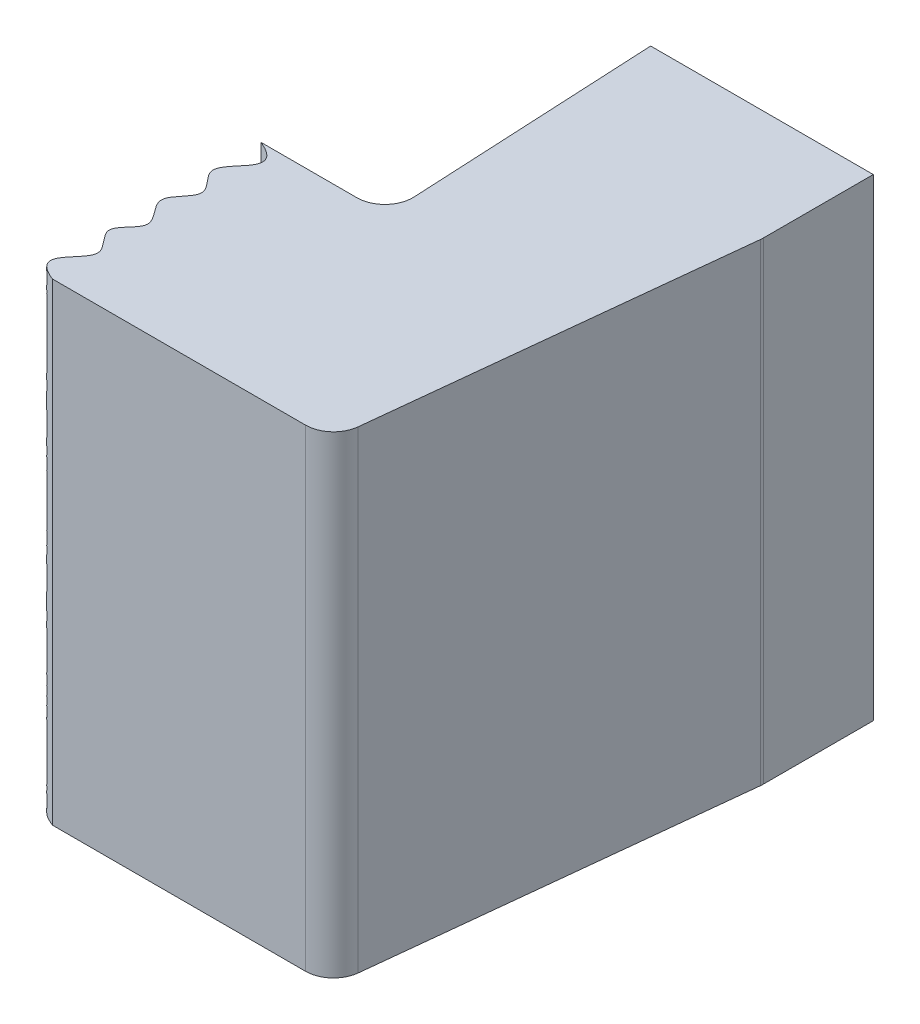
ISO-10303-21;
HEADER;
FILE_DESCRIPTION(('STEP AP214'),'2;1');
FILE_NAME('part.step','',(''),(''),'','','');
FILE_SCHEMA(('AUTOMOTIVE_DESIGN { 1 0 10303 214 1 1 1 1 }'));
ENDSEC;
DATA;
#1=APPLICATION_CONTEXT('core data for automotive mechanical design processes');
#2=APPLICATION_PROTOCOL_DEFINITION('international standard','automotive_design',2000,#1);
#3=PRODUCT_CONTEXT('',#1,'mechanical');
#4=PRODUCT('Part','Part','',(#3));
#5=PRODUCT_RELATED_PRODUCT_CATEGORY('part','',(#4));
#6=PRODUCT_DEFINITION_FORMATION('','',#4);
#7=PRODUCT_DEFINITION_CONTEXT('part definition',#1,'design');
#8=PRODUCT_DEFINITION('design','',#6,#7);
#9=PRODUCT_DEFINITION_SHAPE('','',#8);
#10=(LENGTH_UNIT() NAMED_UNIT(*) SI_UNIT(.MILLI.,.METRE.));
#11=(NAMED_UNIT(*) PLANE_ANGLE_UNIT() SI_UNIT($,.RADIAN.));
#12=(NAMED_UNIT(*) SI_UNIT($,.STERADIAN.) SOLID_ANGLE_UNIT());
#13=UNCERTAINTY_MEASURE_WITH_UNIT(LENGTH_MEASURE(1.E-05),#10,'distance_accuracy_value','');
#14=(GEOMETRIC_REPRESENTATION_CONTEXT(3) GLOBAL_UNCERTAINTY_ASSIGNED_CONTEXT((#13)) GLOBAL_UNIT_ASSIGNED_CONTEXT((#10,
#11,#12)) REPRESENTATION_CONTEXT('',''));
#15=CARTESIAN_POINT('',(0.,0.,0.));
#16=DIRECTION('',(0.,0.,1.));
#17=DIRECTION('',(1.,0.,0.));
#18=AXIS2_PLACEMENT_3D('',#15,#16,#17);
#19=CARTESIAN_POINT('',(0.500000000000004,17.,10.));
#20=DIRECTION('',(0.998752338877845,0.,-0.0499376169438927));
#21=DIRECTION('',(-0.0499376169438927,0.,-0.998752338877845));
#22=AXIS2_PLACEMENT_3D('',#19,#20,#21);
#23=PLANE('',#22);
#24=DIRECTION('',(0.0499376169438927,0.,0.998752338877845));
#25=VECTOR('',#24,1.);
#26=CARTESIAN_POINT('',(0.500000000000004,0.,10.));
#27=LINE('',#26,#25);
#28=CARTESIAN_POINT('',(0.,0.,0.));
#29=VERTEX_POINT('',#28);
#30=CARTESIAN_POINT('',(0.447503119152809,0.,8.95006238305611));
#31=VERTEX_POINT('',#30);
#32=EDGE_CURVE('E187',#29,#31,#27,.T.);
#33=ORIENTED_EDGE('',*,*,#32,.T.);
#34=DIRECTION('',(0.,-1.,0.));
#35=VECTOR('',#34,1.);
#36=CARTESIAN_POINT('',(0.447503119152809,17.,8.95006238305611));
#37=LINE('',#36,#35);
#38=CARTESIAN_POINT('',(0.447503119152809,17.,8.95006238305611));
#39=VERTEX_POINT('',#38);
#40=EDGE_CURVE('E173',#31,#39,#37,.F.);
#41=ORIENTED_EDGE('',*,*,#40,.T.);
#42=DIRECTION('',(0.0499376169438927,0.,0.998752338877845));
#43=VECTOR('',#42,1.);
#44=CARTESIAN_POINT('',(0.500000000000004,17.,10.));
#45=LINE('',#44,#43);
#46=CARTESIAN_POINT('',(0.,17.,0.));
#47=VERTEX_POINT('',#46);
#48=EDGE_CURVE('E124',#47,#39,#45,.T.);
#49=ORIENTED_EDGE('',*,*,#48,.F.);
#50=DIRECTION('',(0.,-1.,0.));
#51=VECTOR('',#50,1.);
#52=CARTESIAN_POINT('',(0.,17.,0.));
#53=LINE('',#52,#51);
#54=EDGE_CURVE('E191',#47,#29,#53,.T.);
#55=ORIENTED_EDGE('',*,*,#54,.T.);
#56=EDGE_LOOP('',(#33,#41,#49,#55));
#57=FACE_BOUND('',#56,.T.);
#58=ADVANCED_FACE('F39',(#57),#23,.F.);
#59=CARTESIAN_POINT('',(-3.5,17.,10.));
#60=DIRECTION('',(0.,0.,1.));
#61=DIRECTION('',(1.,0.,0.));
#62=AXIS2_PLACEMENT_3D('',#59,#60,#61);
#63=PLANE('',#62);
#64=DIRECTION('',(-1.,0.,0.));
#65=VECTOR('',#64,1.);
#66=CARTESIAN_POINT('',(-3.5,17.,10.));
#67=LINE('',#66,#65);
#68=CARTESIAN_POINT('',(-0.551249219725036,17.,10.));
#69=VERTEX_POINT('',#68);
#70=CARTESIAN_POINT('',(-4.,17.,10.));
#71=VERTEX_POINT('',#70);
#72=EDGE_CURVE('E114',#69,#71,#67,.T.);
#73=ORIENTED_EDGE('',*,*,#72,.F.);
#74=DIRECTION('',(0.,-1.,0.));
#75=VECTOR('',#74,1.);
#76=CARTESIAN_POINT('',(-0.551249219725036,0.,10.));
#77=LINE('',#76,#75);
#78=CARTESIAN_POINT('',(-0.551249219725036,0.,10.));
#79=VERTEX_POINT('',#78);
#80=EDGE_CURVE('E174',#69,#79,#77,.T.);
#81=ORIENTED_EDGE('',*,*,#80,.T.);
#82=DIRECTION('',(-1.,0.,0.));
#83=VECTOR('',#82,1.);
#84=CARTESIAN_POINT('',(-3.5,0.,10.));
#85=LINE('',#84,#83);
#86=CARTESIAN_POINT('',(-4.,0.,10.));
#87=VERTEX_POINT('',#86);
#88=EDGE_CURVE('E130',#79,#87,#85,.T.);
#89=ORIENTED_EDGE('',*,*,#88,.T.);
#90=DIRECTION('',(0.,-1.,0.));
#91=VECTOR('',#90,1.);
#92=CARTESIAN_POINT('',(-4.,17.,10.));
#93=LINE('',#92,#91);
#94=EDGE_CURVE('E127',#71,#87,#93,.T.);
#95=ORIENTED_EDGE('',*,*,#94,.F.);
#96=EDGE_LOOP('',(#73,#81,#89,#95));
#97=FACE_BOUND('',#96,.T.);
#98=ADVANCED_FACE('F128',(#97),#63,.F.);
#99=CARTESIAN_POINT('',(-4.,17.,10.));
#100=CARTESIAN_POINT('',(-2.52012960724628,17.,10.6064710764392));
#101=CARTESIAN_POINT('',(-4.86639153091159,17.,11.4740497128714));
#102=CARTESIAN_POINT('',(-3.03225730392594,17.,12.6462103244048));
#103=CARTESIAN_POINT('',(-4.5277805871802,17.,13.5842305746882));
#104=CARTESIAN_POINT('',(-2.99169041630414,17.,14.5770558654744));
#105=CARTESIAN_POINT('',(-4.46066173194962,17.,15.4465882850454));
#106=CARTESIAN_POINT('',(-2.63893410316966,17.,16.6074039343731));
#107=CARTESIAN_POINT('',(-4.90806496712102,17.,17.4384014712583));
#108=CARTESIAN_POINT('',(-3.5,17.,18.));
#109=B_SPLINE_CURVE_WITH_KNOTS('',3,(#99,#100,#101,#102,#103,#104,#105,#106,#107,#108),
.UNSPECIFIED.,.F.,.F.,(4,1,1,1,1,1,1,4),(0.,0.221861930951979,0.329573951751871,
0.444854002419631,0.572311822933468,0.676833042498847,0.78776867286648,1.),.UNSPECIFIED.);
#110=DIRECTION('',(0.,-1.,0.));
#111=VECTOR('',#110,1.);
#112=SURFACE_OF_LINEAR_EXTRUSION('',#109,#111);
#113=CARTESIAN_POINT('',(-4.,0.,10.));
#114=CARTESIAN_POINT('',(-2.52012960724628,0.,10.6064710764392));
#115=CARTESIAN_POINT('',(-4.86639153091159,0.,11.4740497128714));
#116=CARTESIAN_POINT('',(-3.03225730392594,0.,12.6462103244048));
#117=CARTESIAN_POINT('',(-4.5277805871802,0.,13.5842305746882));
#118=CARTESIAN_POINT('',(-2.99169041630414,0.,14.5770558654744));
#119=CARTESIAN_POINT('',(-4.46066173194962,0.,15.4465882850454));
#120=CARTESIAN_POINT('',(-2.63893410316966,0.,16.6074039343731));
#121=CARTESIAN_POINT('',(-4.90806496712102,0.,17.4384014712583));
#122=CARTESIAN_POINT('',(-3.5,0.,18.));
#123=B_SPLINE_CURVE_WITH_KNOTS('',3,(#113,#114,#115,#116,#117,#118,#119,#120,#121,#122),
.UNSPECIFIED.,.F.,.F.,(4,1,1,1,1,1,1,4),(0.,0.221861930951979,0.329573951751871,
0.444854002419631,0.572311822933468,0.676833042498847,0.78776867286648,1.),.UNSPECIFIED.);
#124=CARTESIAN_POINT('',(-3.5,0.,18.));
#125=VERTEX_POINT('',#124);
#126=EDGE_CURVE('E193',#87,#125,#123,.T.);
#127=ORIENTED_EDGE('',*,*,#126,.T.);
#128=DIRECTION('',(0.,-1.,0.));
#129=VECTOR('',#128,1.);
#130=CARTESIAN_POINT('',(-3.5,17.,18.));
#131=LINE('',#130,#129);
#132=CARTESIAN_POINT('',(-3.5,17.,18.));
#133=VERTEX_POINT('',#132);
#134=EDGE_CURVE('E134',#133,#125,#131,.T.);
#135=ORIENTED_EDGE('',*,*,#134,.F.);
#136=EDGE_CURVE('E119',#71,#133,#109,.T.);
#137=ORIENTED_EDGE('',*,*,#136,.F.);
#138=ORIENTED_EDGE('',*,*,#94,.T.);
#139=EDGE_LOOP('',(#127,#135,#137,#138));
#140=FACE_BOUND('',#139,.T.);
#141=ADVANCED_FACE('F136',(#140),#112,.F.);
#142=CARTESIAN_POINT('',(6.5,17.,18.));
#143=DIRECTION('',(0.,0.,-1.));
#144=DIRECTION('',(-1.,0.,0.));
#145=AXIS2_PLACEMENT_3D('',#142,#143,#144);
#146=PLANE('',#145);
#147=DIRECTION('',(1.,0.,0.));
#148=VECTOR('',#147,1.);
#149=CARTESIAN_POINT('',(6.5,0.,18.));
#150=LINE('',#149,#148);
#151=CARTESIAN_POINT('',(5.60141943997652,0.,18.));
#152=VERTEX_POINT('',#151);
#153=EDGE_CURVE('E202',#125,#152,#150,.T.);
#154=ORIENTED_EDGE('',*,*,#153,.T.);
#155=DIRECTION('',(0.,-1.,0.));
#156=VECTOR('',#155,1.);
#157=CARTESIAN_POINT('',(5.60141943997652,17.,18.));
#158=LINE('',#157,#156);
#159=CARTESIAN_POINT('',(5.60141943997652,17.,18.));
#160=VERTEX_POINT('',#159);
#161=EDGE_CURVE('E54',#152,#160,#158,.F.);
#162=ORIENTED_EDGE('',*,*,#161,.T.);
#163=DIRECTION('',(1.,0.,0.));
#164=VECTOR('',#163,1.);
#165=CARTESIAN_POINT('',(6.5,17.,18.));
#166=LINE('',#165,#164);
#167=EDGE_CURVE('E138',#133,#160,#166,.T.);
#168=ORIENTED_EDGE('',*,*,#167,.F.);
#169=ORIENTED_EDGE('',*,*,#134,.T.);
#170=EDGE_LOOP('',(#154,#162,#168,#169));
#171=FACE_BOUND('',#170,.T.);
#172=ADVANCED_FACE('F154',(#171),#146,.F.);
#173=CARTESIAN_POINT('',(8.,17.,4.));
#174=DIRECTION('',(-0.994309153919809,0.,-0.106533123634265));
#175=DIRECTION('',(-0.106533123634265,0.,0.994309153919809));
#176=AXIS2_PLACEMENT_3D('',#173,#174,#175);
#177=PLANE('',#176);
#178=DIRECTION('',(0.106533123634265,0.,-0.994309153919809));
#179=VECTOR('',#178,1.);
#180=CARTESIAN_POINT('',(8.,0.,4.));
#181=LINE('',#180,#179);
#182=CARTESIAN_POINT('',(6.59572859389633,0.,17.1065331236343));
#183=VERTEX_POINT('',#182);
#184=CARTESIAN_POINT('',(7.99430915391981,0.,4.05311456341512));
#185=VERTEX_POINT('',#184);
#186=EDGE_CURVE('E207',#183,#185,#181,.T.);
#187=ORIENTED_EDGE('',*,*,#186,.T.);
#188=DIRECTION('',(0.,-1.,0.));
#189=VECTOR('',#188,1.);
#190=CARTESIAN_POINT('',(7.99430915391981,17.,4.05311456341512));
#191=LINE('',#190,#189);
#192=CARTESIAN_POINT('',(7.99430915391981,17.,4.05311456341512));
#193=VERTEX_POINT('',#192);
#194=EDGE_CURVE('E228',#185,#193,#191,.F.);
#195=ORIENTED_EDGE('',*,*,#194,.T.);
#196=DIRECTION('',(0.106533123634265,0.,-0.994309153919809));
#197=VECTOR('',#196,1.);
#198=CARTESIAN_POINT('',(8.,17.,4.));
#199=LINE('',#198,#197);
#200=CARTESIAN_POINT('',(6.59572859389633,17.,17.1065331236343));
#201=VERTEX_POINT('',#200);
#202=EDGE_CURVE('E140',#201,#193,#199,.T.);
#203=ORIENTED_EDGE('',*,*,#202,.F.);
#204=DIRECTION('',(0.,-1.,0.));
#205=VECTOR('',#204,1.);
#206=CARTESIAN_POINT('',(6.59572859389633,17.,17.1065331236343));
#207=LINE('',#206,#205);
#208=EDGE_CURVE('E225',#201,#183,#207,.T.);
#209=ORIENTED_EDGE('',*,*,#208,.T.);
#210=EDGE_LOOP('',(#187,#195,#203,#209));
#211=FACE_BOUND('',#210,.T.);
#212=ADVANCED_FACE('F234',(#211),#177,.F.);
#213=CARTESIAN_POINT('',(8.,17.,0.));
#214=DIRECTION('',(-1.,0.,0.));
#215=DIRECTION('',(0.,0.,1.));
#216=AXIS2_PLACEMENT_3D('',#213,#214,#215);
#217=PLANE('',#216);
#218=DIRECTION('',(0.,0.,-1.));
#219=VECTOR('',#218,1.);
#220=CARTESIAN_POINT('',(8.,17.,0.));
#221=LINE('',#220,#219);
#222=CARTESIAN_POINT('',(8.,17.,3.94658143978085));
#223=VERTEX_POINT('',#222);
#224=CARTESIAN_POINT('',(8.,17.,0.));
#225=VERTEX_POINT('',#224);
#226=EDGE_CURVE('E237',#223,#225,#221,.T.);
#227=ORIENTED_EDGE('',*,*,#226,.F.);
#228=DIRECTION('',(0.,-1.,0.));
#229=VECTOR('',#228,1.);
#230=CARTESIAN_POINT('',(8.,17.,3.94658143978085));
#231=LINE('',#230,#229);
#232=CARTESIAN_POINT('',(8.,0.,3.94658143978085));
#233=VERTEX_POINT('',#232);
#234=EDGE_CURVE('E133',#223,#233,#231,.T.);
#235=ORIENTED_EDGE('',*,*,#234,.T.);
#236=DIRECTION('',(0.,0.,-1.));
#237=VECTOR('',#236,1.);
#238=CARTESIAN_POINT('',(8.,0.,0.));
#239=LINE('',#238,#237);
#240=CARTESIAN_POINT('',(8.,0.,0.));
#241=VERTEX_POINT('',#240);
#242=EDGE_CURVE('E210',#233,#241,#239,.T.);
#243=ORIENTED_EDGE('',*,*,#242,.T.);
#244=DIRECTION('',(0.,-1.,0.));
#245=VECTOR('',#244,1.);
#246=CARTESIAN_POINT('',(8.,17.,0.));
#247=LINE('',#246,#245);
#248=EDGE_CURVE('E215',#225,#241,#247,.T.);
#249=ORIENTED_EDGE('',*,*,#248,.F.);
#250=EDGE_LOOP('',(#227,#235,#243,#249));
#251=FACE_BOUND('',#250,.T.);
#252=ADVANCED_FACE('F243',(#251),#217,.F.);
#253=CARTESIAN_POINT('',(0.,17.,0.));
#254=DIRECTION('',(0.,0.,1.));
#255=DIRECTION('',(1.,0.,0.));
#256=AXIS2_PLACEMENT_3D('',#253,#254,#255);
#257=PLANE('',#256);
#258=DIRECTION('',(-1.,0.,0.));
#259=VECTOR('',#258,1.);
#260=CARTESIAN_POINT('',(0.,0.,0.));
#261=LINE('',#260,#259);
#262=EDGE_CURVE('E212',#241,#29,#261,.T.);
#263=ORIENTED_EDGE('',*,*,#262,.T.);
#264=ORIENTED_EDGE('',*,*,#54,.F.);
#265=DIRECTION('',(-1.,0.,0.));
#266=VECTOR('',#265,1.);
#267=CARTESIAN_POINT('',(0.,17.,0.));
#268=LINE('',#267,#266);
#269=EDGE_CURVE('E196',#225,#47,#268,.T.);
#270=ORIENTED_EDGE('',*,*,#269,.F.);
#271=ORIENTED_EDGE('',*,*,#248,.T.);
#272=EDGE_LOOP('',(#263,#264,#270,#271));
#273=FACE_BOUND('',#272,.T.);
#274=ADVANCED_FACE('F247',(#273),#257,.F.);
#275=CARTESIAN_POINT('',(-3.79300925290394,17.,14.0228021976552));
#276=DIRECTION('',(0.,1.,0.));
#277=DIRECTION('',(0.,0.,1.));
#278=AXIS2_PLACEMENT_3D('',#275,#276,#277);
#279=PLANE('',#278);
#280=ORIENTED_EDGE('',*,*,#202,.T.);
#281=CARTESIAN_POINT('',(7.,17.,3.94658143978085));
#282=DIRECTION('',(0.,1.,0.));
#283=DIRECTION('',(0.,0.,1.));
#284=AXIS2_PLACEMENT_3D('',#281,#282,#283);
#285=CIRCLE('',#284,1.);
#286=EDGE_CURVE('E175',#193,#223,#285,.T.);
#287=ORIENTED_EDGE('',*,*,#286,.T.);
#288=ORIENTED_EDGE('',*,*,#226,.T.);
#289=ORIENTED_EDGE('',*,*,#269,.T.);
#290=ORIENTED_EDGE('',*,*,#48,.T.);
#291=CARTESIAN_POINT('',(-0.551249219725036,17.,9.));
#292=DIRECTION('',(0.,1.,0.));
#293=DIRECTION('',(0.,0.,1.));
#294=AXIS2_PLACEMENT_3D('',#291,#292,#293);
#295=CIRCLE('',#294,1.);
#296=EDGE_CURVE('E11',#39,#69,#295,.F.);
#297=ORIENTED_EDGE('',*,*,#296,.T.);
#298=ORIENTED_EDGE('',*,*,#72,.T.);
#299=ORIENTED_EDGE('',*,*,#136,.T.);
#300=ORIENTED_EDGE('',*,*,#167,.T.);
#301=CARTESIAN_POINT('',(5.60141943997652,17.,17.));
#302=DIRECTION('',(0.,1.,0.));
#303=DIRECTION('',(0.,0.,1.));
#304=AXIS2_PLACEMENT_3D('',#301,#302,#303);
#305=CIRCLE('',#304,1.);
#306=EDGE_CURVE('E178',#160,#201,#305,.T.);
#307=ORIENTED_EDGE('',*,*,#306,.T.);
#308=EDGE_LOOP('',(#280,#287,#288,#289,#290,#297,#298,#299,#300,#307));
#309=FACE_BOUND('',#308,.T.);
#310=ADVANCED_FACE('F117',(#309),#279,.T.);
#311=CARTESIAN_POINT('',(-3.79300925290394,0.,14.0228021976552));
#312=DIRECTION('',(0.,1.,0.));
#313=DIRECTION('',(0.,0.,1.));
#314=AXIS2_PLACEMENT_3D('',#311,#312,#313);
#315=PLANE('',#314);
#316=ORIENTED_EDGE('',*,*,#242,.F.);
#317=CARTESIAN_POINT('',(7.,0.,3.94658143978085));
#318=DIRECTION('',(0.,1.,0.));
#319=DIRECTION('',(0.,0.,1.));
#320=AXIS2_PLACEMENT_3D('',#317,#318,#319);
#321=CIRCLE('',#320,1.);
#322=EDGE_CURVE('E223',#233,#185,#321,.F.);
#323=ORIENTED_EDGE('',*,*,#322,.T.);
#324=ORIENTED_EDGE('',*,*,#186,.F.);
#325=CARTESIAN_POINT('',(5.60141943997652,0.,17.));
#326=DIRECTION('',(0.,1.,0.));
#327=DIRECTION('',(0.,0.,1.));
#328=AXIS2_PLACEMENT_3D('',#325,#326,#327);
#329=CIRCLE('',#328,1.);
#330=EDGE_CURVE('E221',#183,#152,#329,.F.);
#331=ORIENTED_EDGE('',*,*,#330,.T.);
#332=ORIENTED_EDGE('',*,*,#153,.F.);
#333=ORIENTED_EDGE('',*,*,#126,.F.);
#334=ORIENTED_EDGE('',*,*,#88,.F.);
#335=CARTESIAN_POINT('',(-0.551249219725036,0.,9.));
#336=DIRECTION('',(0.,1.,0.));
#337=DIRECTION('',(0.,0.,1.));
#338=AXIS2_PLACEMENT_3D('',#335,#336,#337);
#339=CIRCLE('',#338,1.);
#340=EDGE_CURVE('E47',#79,#31,#339,.T.);
#341=ORIENTED_EDGE('',*,*,#340,.T.);
#342=ORIENTED_EDGE('',*,*,#32,.F.);
#343=ORIENTED_EDGE('',*,*,#262,.F.);
#344=EDGE_LOOP('',(#316,#323,#324,#331,#332,#333,#334,#341,#342,#343));
#345=FACE_BOUND('',#344,.T.);
#346=ADVANCED_FACE('F164',(#345),#315,.F.);
#347=CARTESIAN_POINT('',(7.,17.,3.94658143978085));
#348=DIRECTION('',(0.,-1.,0.));
#349=DIRECTION('',(0.,0.,-1.));
#350=AXIS2_PLACEMENT_3D('',#347,#348,#349);
#351=CYLINDRICAL_SURFACE('',#350,1.);
#352=ORIENTED_EDGE('',*,*,#286,.F.);
#353=ORIENTED_EDGE('',*,*,#194,.F.);
#354=ORIENTED_EDGE('',*,*,#322,.F.);
#355=ORIENTED_EDGE('',*,*,#234,.F.);
#356=EDGE_LOOP('',(#352,#353,#354,#355));
#357=FACE_BOUND('',#356,.T.);
#358=ADVANCED_FACE('F161',(#357),#351,.T.);
#359=CARTESIAN_POINT('',(-0.551249219725036,17.,9.));
#360=DIRECTION('',(0.,1.,0.));
#361=DIRECTION('',(0.,0.,1.));
#362=AXIS2_PLACEMENT_3D('',#359,#360,#361);
#363=CYLINDRICAL_SURFACE('',#362,1.);
#364=ORIENTED_EDGE('',*,*,#296,.F.);
#365=ORIENTED_EDGE('',*,*,#40,.F.);
#366=ORIENTED_EDGE('',*,*,#340,.F.);
#367=ORIENTED_EDGE('',*,*,#80,.F.);
#368=EDGE_LOOP('',(#364,#365,#366,#367));
#369=FACE_BOUND('',#368,.T.);
#370=ADVANCED_FACE('F163',(#369),#363,.F.);
#371=CARTESIAN_POINT('',(5.60141943997652,17.,17.));
#372=DIRECTION('',(0.,-1.,0.));
#373=DIRECTION('',(0.,0.,-1.));
#374=AXIS2_PLACEMENT_3D('',#371,#372,#373);
#375=CYLINDRICAL_SURFACE('',#374,1.);
#376=ORIENTED_EDGE('',*,*,#306,.F.);
#377=ORIENTED_EDGE('',*,*,#161,.F.);
#378=ORIENTED_EDGE('',*,*,#330,.F.);
#379=ORIENTED_EDGE('',*,*,#208,.F.);
#380=EDGE_LOOP('',(#376,#377,#378,#379));
#381=FACE_BOUND('',#380,.T.);
#382=ADVANCED_FACE('F41',(#381),#375,.T.);
#383=CLOSED_SHELL('',(#58,#98,#141,#172,#212,#252,#274,#310,#346,#358,#370,#382));
#384=MANIFOLD_SOLID_BREP('B2',#383);
#385=ADVANCED_BREP_SHAPE_REPRESENTATION('',(#18,#384),#14);
#386=SHAPE_DEFINITION_REPRESENTATION(#9,#385);
ENDSEC;
END-ISO-10303-21;
